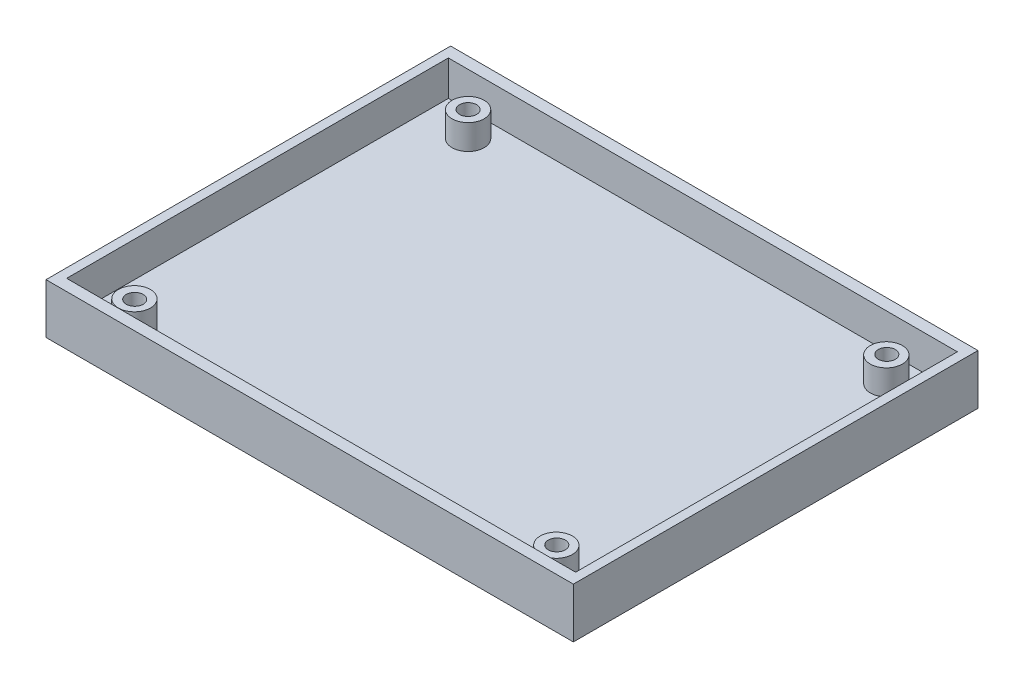
ISO-10303-21;
HEADER;
FILE_DESCRIPTION(('STEP AP214'),'2;1');
FILE_NAME('part.step','',(''),(''),'','','');
FILE_SCHEMA(('AUTOMOTIVE_DESIGN { 1 0 10303 214 1 1 1 1 }'));
ENDSEC;
DATA;
#1=APPLICATION_CONTEXT('core data for automotive mechanical design processes');
#2=APPLICATION_PROTOCOL_DEFINITION('international standard','automotive_design',2000,#1);
#3=PRODUCT_CONTEXT('',#1,'mechanical');
#4=PRODUCT('Part','Part','',(#3));
#5=PRODUCT_RELATED_PRODUCT_CATEGORY('part','',(#4));
#6=PRODUCT_DEFINITION_FORMATION('','',#4);
#7=PRODUCT_DEFINITION_CONTEXT('part definition',#1,'design');
#8=PRODUCT_DEFINITION('design','',#6,#7);
#9=PRODUCT_DEFINITION_SHAPE('','',#8);
#10=(LENGTH_UNIT() NAMED_UNIT(*) SI_UNIT(.MILLI.,.METRE.));
#11=(NAMED_UNIT(*) PLANE_ANGLE_UNIT() SI_UNIT($,.RADIAN.));
#12=(NAMED_UNIT(*) SI_UNIT($,.STERADIAN.) SOLID_ANGLE_UNIT());
#13=UNCERTAINTY_MEASURE_WITH_UNIT(LENGTH_MEASURE(1.E-05),#10,'distance_accuracy_value','');
#14=(GEOMETRIC_REPRESENTATION_CONTEXT(3) GLOBAL_UNCERTAINTY_ASSIGNED_CONTEXT((#13)) GLOBAL_UNIT_ASSIGNED_CONTEXT((#10,
#11,#12)) REPRESENTATION_CONTEXT('',''));
#15=CARTESIAN_POINT('',(0.,0.,0.));
#16=DIRECTION('',(0.,0.,1.));
#17=DIRECTION('',(1.,0.,0.));
#18=AXIS2_PLACEMENT_3D('',#15,#16,#17);
#19=CARTESIAN_POINT('',(0.,3.,0.));
#20=DIRECTION('',(0.,1.,0.));
#21=DIRECTION('',(0.,0.,1.));
#22=AXIS2_PLACEMENT_3D('',#19,#20,#21);
#23=PLANE('',#22);
#24=CARTESIAN_POINT('',(42.2061859404252,3.,33.3587219433355));
#25=DIRECTION('',(0.,1.,0.));
#26=DIRECTION('',(0.,0.,1.));
#27=AXIS2_PLACEMENT_3D('',#24,#25,#26);
#28=CIRCLE('',#27,3.20126111857841);
#29=CARTESIAN_POINT('',(42.2061859404252,3.,36.5599830619139));
#30=VERTEX_POINT('',#29);
#31=EDGE_CURVE('E182',#30,#30,#28,.T.);
#32=ORIENTED_EDGE('',*,*,#31,.F.);
#33=EDGE_LOOP('',(#32));
#34=FACE_BOUND('',#33,.T.);
#35=CARTESIAN_POINT('',(-42.5117529195093,3.,32.859842276581));
#36=DIRECTION('',(0.,1.,0.));
#37=DIRECTION('',(0.,0.,1.));
#38=AXIS2_PLACEMENT_3D('',#35,#36,#37);
#39=CIRCLE('',#38,3.20126111857841);
#40=CARTESIAN_POINT('',(-42.5117529195093,3.,36.0611033951594));
#41=VERTEX_POINT('',#40);
#42=EDGE_CURVE('E194',#41,#41,#39,.T.);
#43=ORIENTED_EDGE('',*,*,#42,.F.);
#44=EDGE_LOOP('',(#43));
#45=FACE_BOUND('',#44,.T.);
#46=CARTESIAN_POINT('',(42.2258959836118,3.,-32.4941746176851));
#47=DIRECTION('',(0.,1.,0.));
#48=DIRECTION('',(0.,0.,1.));
#49=AXIS2_PLACEMENT_3D('',#46,#47,#48);
#50=CIRCLE('',#49,3.20126111857841);
#51=CARTESIAN_POINT('',(42.2258959836118,3.,-29.2929134991067));
#52=VERTEX_POINT('',#51);
#53=EDGE_CURVE('E198',#52,#52,#50,.T.);
#54=ORIENTED_EDGE('',*,*,#53,.F.);
#55=EDGE_LOOP('',(#54));
#56=FACE_BOUND('',#55,.T.);
#57=CARTESIAN_POINT('',(-41.91,3.,-33.147));
#58=DIRECTION('',(0.,1.,0.));
#59=DIRECTION('',(0.,0.,1.));
#60=AXIS2_PLACEMENT_3D('',#57,#58,#59);
#61=CIRCLE('',#60,3.20126111857841);
#62=CARTESIAN_POINT('',(-41.91,3.,-29.9457388814216));
#63=VERTEX_POINT('',#62);
#64=EDGE_CURVE('E202',#63,#63,#61,.T.);
#65=ORIENTED_EDGE('',*,*,#64,.F.);
#66=EDGE_LOOP('',(#65));
#67=FACE_BOUND('',#66,.T.);
#68=DIRECTION('',(1.,0.,0.));
#69=VECTOR('',#68,1.);
#70=CARTESIAN_POINT('',(0.,3.,38.1));
#71=LINE('',#70,#69);
#72=CARTESIAN_POINT('',(-50.8,3.,38.1));
#73=VERTEX_POINT('',#72);
#74=CARTESIAN_POINT('',(50.8,3.,38.1));
#75=VERTEX_POINT('',#74);
#76=EDGE_CURVE('E206',#73,#75,#71,.T.);
#77=ORIENTED_EDGE('',*,*,#76,.T.);
#78=DIRECTION('',(0.,0.,-1.));
#79=VECTOR('',#78,1.);
#80=CARTESIAN_POINT('',(50.8,3.,0.));
#81=LINE('',#80,#79);
#82=CARTESIAN_POINT('',(50.8,3.,-38.1));
#83=VERTEX_POINT('',#82);
#84=EDGE_CURVE('E108',#75,#83,#81,.T.);
#85=ORIENTED_EDGE('',*,*,#84,.T.);
#86=DIRECTION('',(1.,0.,0.));
#87=VECTOR('',#86,1.);
#88=CARTESIAN_POINT('',(0.,3.,-38.1));
#89=LINE('',#88,#87);
#90=CARTESIAN_POINT('',(-50.8,3.,-38.1));
#91=VERTEX_POINT('',#90);
#92=EDGE_CURVE('E50',#91,#83,#89,.T.);
#93=ORIENTED_EDGE('',*,*,#92,.F.);
#94=DIRECTION('',(0.,0.,-1.));
#95=VECTOR('',#94,1.);
#96=CARTESIAN_POINT('',(-50.8,3.,0.));
#97=LINE('',#96,#95);
#98=EDGE_CURVE('E11',#73,#91,#97,.T.);
#99=ORIENTED_EDGE('',*,*,#98,.F.);
#100=EDGE_LOOP('',(#77,#85,#93,#99));
#101=FACE_BOUND('',#100,.T.);
#102=ADVANCED_FACE('F41',(#34,#45,#56,#67,#101),#23,.T.);
#103=CARTESIAN_POINT('',(0.,0.,0.));
#104=DIRECTION('',(0.,1.,0.));
#105=DIRECTION('',(0.,0.,1.));
#106=AXIS2_PLACEMENT_3D('',#103,#104,#105);
#107=PLANE('',#106);
#108=DIRECTION('',(1.,0.,0.));
#109=VECTOR('',#108,1.);
#110=CARTESIAN_POINT('',(0.,0.,40.384480661127));
#111=LINE('',#110,#109);
#112=CARTESIAN_POINT('',(-52.6322329927802,0.,40.384480661127));
#113=VERTEX_POINT('',#112);
#114=CARTESIAN_POINT('',(52.6322329927802,0.,40.384480661127));
#115=VERTEX_POINT('',#114);
#116=EDGE_CURVE('E154',#113,#115,#111,.T.);
#117=ORIENTED_EDGE('',*,*,#116,.F.);
#118=DIRECTION('',(0.,0.,-1.));
#119=VECTOR('',#118,1.);
#120=CARTESIAN_POINT('',(-52.6322329927802,0.,0.));
#121=LINE('',#120,#119);
#122=CARTESIAN_POINT('',(-52.6322329927802,0.,-40.384480661127));
#123=VERTEX_POINT('',#122);
#124=EDGE_CURVE('E124',#113,#123,#121,.T.);
#125=ORIENTED_EDGE('',*,*,#124,.T.);
#126=DIRECTION('',(1.,0.,0.));
#127=VECTOR('',#126,1.);
#128=CARTESIAN_POINT('',(0.,0.,-40.384480661127));
#129=LINE('',#128,#127);
#130=CARTESIAN_POINT('',(52.6322329927802,0.,-40.384480661127));
#131=VERTEX_POINT('',#130);
#132=EDGE_CURVE('E163',#123,#131,#129,.T.);
#133=ORIENTED_EDGE('',*,*,#132,.T.);
#134=DIRECTION('',(0.,0.,-1.));
#135=VECTOR('',#134,1.);
#136=CARTESIAN_POINT('',(52.6322329927802,0.,0.));
#137=LINE('',#136,#135);
#138=EDGE_CURVE('E158',#115,#131,#137,.T.);
#139=ORIENTED_EDGE('',*,*,#138,.F.);
#140=EDGE_LOOP('',(#117,#125,#133,#139));
#141=FACE_BOUND('',#140,.T.);
#142=CARTESIAN_POINT('',(-41.91,0.,-33.147));
#143=DIRECTION('',(0.,1.,0.));
#144=DIRECTION('',(0.,0.,1.));
#145=AXIS2_PLACEMENT_3D('',#142,#143,#144);
#146=CIRCLE('',#145,1.7);
#147=CARTESIAN_POINT('',(-41.91,0.,-31.447));
#148=VERTEX_POINT('',#147);
#149=EDGE_CURVE('E357',#148,#148,#146,.T.);
#150=ORIENTED_EDGE('',*,*,#149,.T.);
#151=EDGE_LOOP('',(#150));
#152=FACE_BOUND('',#151,.T.);
#153=CARTESIAN_POINT('',(42.2050924942106,0.,33.2675434954366));
#154=DIRECTION('',(0.,1.,0.));
#155=DIRECTION('',(0.,0.,1.));
#156=AXIS2_PLACEMENT_3D('',#153,#154,#155);
#157=CIRCLE('',#156,1.7);
#158=CARTESIAN_POINT('',(42.2050924942106,0.,34.9675434954366));
#159=VERTEX_POINT('',#158);
#160=EDGE_CURVE('E347',#159,#159,#157,.T.);
#161=ORIENTED_EDGE('',*,*,#160,.T.);
#162=EDGE_LOOP('',(#161));
#163=FACE_BOUND('',#162,.T.);
#164=CARTESIAN_POINT('',(-42.3706026608546,0.,32.9365231621487));
#165=DIRECTION('',(0.,1.,0.));
#166=DIRECTION('',(0.,0.,1.));
#167=AXIS2_PLACEMENT_3D('',#164,#165,#166);
#168=CIRCLE('',#167,1.7);
#169=CARTESIAN_POINT('',(-42.3706026608546,0.,34.6365231621486));
#170=VERTEX_POINT('',#169);
#171=EDGE_CURVE('E328',#170,#170,#168,.T.);
#172=ORIENTED_EDGE('',*,*,#171,.T.);
#173=EDGE_LOOP('',(#172));
#174=FACE_BOUND('',#173,.T.);
#175=CARTESIAN_POINT('',(42.2050924942106,0.,-32.6055028288607));
#176=DIRECTION('',(0.,1.,0.));
#177=DIRECTION('',(0.,0.,1.));
#178=AXIS2_PLACEMENT_3D('',#175,#176,#177);
#179=CIRCLE('',#178,1.7);
#180=CARTESIAN_POINT('',(42.2050924942106,0.,-30.9055028288607));
#181=VERTEX_POINT('',#180);
#182=EDGE_CURVE('E335',#181,#181,#179,.T.);
#183=ORIENTED_EDGE('',*,*,#182,.T.);
#184=EDGE_LOOP('',(#183));
#185=FACE_BOUND('',#184,.T.);
#186=ADVANCED_FACE('F43',(#141,#152,#163,#174,#185),#107,.F.);
#187=CARTESIAN_POINT('',(0.,10.,40.384480661127));
#188=DIRECTION('',(0.,0.,-1.));
#189=DIRECTION('',(-1.,0.,0.));
#190=AXIS2_PLACEMENT_3D('',#187,#188,#189);
#191=PLANE('',#190);
#192=ORIENTED_EDGE('',*,*,#116,.T.);
#193=DIRECTION('',(0.,-1.,0.));
#194=VECTOR('',#193,1.);
#195=CARTESIAN_POINT('',(52.6322329927802,10.,40.384480661127));
#196=LINE('',#195,#194);
#197=CARTESIAN_POINT('',(52.6322329927802,10.,40.384480661127));
#198=VERTEX_POINT('',#197);
#199=EDGE_CURVE('E178',#198,#115,#196,.T.);
#200=ORIENTED_EDGE('',*,*,#199,.F.);
#201=DIRECTION('',(1.,0.,0.));
#202=VECTOR('',#201,1.);
#203=CARTESIAN_POINT('',(0.,10.,40.384480661127));
#204=LINE('',#203,#202);
#205=CARTESIAN_POINT('',(-52.6322329927802,10.,40.384480661127));
#206=VERTEX_POINT('',#205);
#207=EDGE_CURVE('E138',#206,#198,#204,.T.);
#208=ORIENTED_EDGE('',*,*,#207,.F.);
#209=DIRECTION('',(0.,-1.,0.));
#210=VECTOR('',#209,1.);
#211=CARTESIAN_POINT('',(-52.6322329927802,10.,40.384480661127));
#212=LINE('',#211,#210);
#213=EDGE_CURVE('E112',#206,#113,#212,.T.);
#214=ORIENTED_EDGE('',*,*,#213,.T.);
#215=EDGE_LOOP('',(#192,#200,#208,#214));
#216=FACE_BOUND('',#215,.T.);
#217=ADVANCED_FACE('F230',(#216),#191,.F.);
#218=CARTESIAN_POINT('',(52.6322329927802,10.,0.));
#219=DIRECTION('',(-1.,0.,0.));
#220=DIRECTION('',(0.,0.,1.));
#221=AXIS2_PLACEMENT_3D('',#218,#219,#220);
#222=PLANE('',#221);
#223=ORIENTED_EDGE('',*,*,#138,.T.);
#224=DIRECTION('',(0.,-1.,0.));
#225=VECTOR('',#224,1.);
#226=CARTESIAN_POINT('',(52.6322329927802,10.,-40.384480661127));
#227=LINE('',#226,#225);
#228=CARTESIAN_POINT('',(52.6322329927802,10.,-40.384480661127));
#229=VERTEX_POINT('',#228);
#230=EDGE_CURVE('E175',#229,#131,#227,.T.);
#231=ORIENTED_EDGE('',*,*,#230,.F.);
#232=DIRECTION('',(0.,0.,-1.));
#233=VECTOR('',#232,1.);
#234=CARTESIAN_POINT('',(52.6322329927802,10.,0.));
#235=LINE('',#234,#233);
#236=EDGE_CURVE('E142',#198,#229,#235,.T.);
#237=ORIENTED_EDGE('',*,*,#236,.F.);
#238=ORIENTED_EDGE('',*,*,#199,.T.);
#239=EDGE_LOOP('',(#223,#231,#237,#238));
#240=FACE_BOUND('',#239,.T.);
#241=ADVANCED_FACE('F240',(#240),#222,.F.);
#242=CARTESIAN_POINT('',(0.,10.,-40.384480661127));
#243=DIRECTION('',(0.,0.,-1.));
#244=DIRECTION('',(-1.,0.,0.));
#245=AXIS2_PLACEMENT_3D('',#242,#243,#244);
#246=PLANE('',#245);
#247=ORIENTED_EDGE('',*,*,#132,.F.);
#248=DIRECTION('',(0.,-1.,0.));
#249=VECTOR('',#248,1.);
#250=CARTESIAN_POINT('',(-52.6322329927802,10.,-40.384480661127));
#251=LINE('',#250,#249);
#252=CARTESIAN_POINT('',(-52.6322329927802,10.,-40.384480661127));
#253=VERTEX_POINT('',#252);
#254=EDGE_CURVE('E172',#253,#123,#251,.T.);
#255=ORIENTED_EDGE('',*,*,#254,.F.);
#256=DIRECTION('',(1.,0.,0.));
#257=VECTOR('',#256,1.);
#258=CARTESIAN_POINT('',(0.,10.,-40.384480661127));
#259=LINE('',#258,#257);
#260=EDGE_CURVE('E145',#253,#229,#259,.T.);
#261=ORIENTED_EDGE('',*,*,#260,.T.);
#262=ORIENTED_EDGE('',*,*,#230,.T.);
#263=EDGE_LOOP('',(#247,#255,#261,#262));
#264=FACE_BOUND('',#263,.T.);
#265=ADVANCED_FACE('F236',(#264),#246,.T.);
#266=CARTESIAN_POINT('',(50.8,10.,0.));
#267=DIRECTION('',(-1.,0.,0.));
#268=DIRECTION('',(0.,0.,1.));
#269=AXIS2_PLACEMENT_3D('',#266,#267,#268);
#270=PLANE('',#269);
#271=DIRECTION('',(0.,-1.,0.));
#272=VECTOR('',#271,1.);
#273=CARTESIAN_POINT('',(50.8,10.,-38.1));
#274=LINE('',#273,#272);
#275=CARTESIAN_POINT('',(50.8,10.,-38.1));
#276=VERTEX_POINT('',#275);
#277=EDGE_CURVE('E153',#276,#83,#274,.T.);
#278=ORIENTED_EDGE('',*,*,#277,.T.);
#279=ORIENTED_EDGE('',*,*,#84,.F.);
#280=DIRECTION('',(0.,-1.,0.));
#281=VECTOR('',#280,1.);
#282=CARTESIAN_POINT('',(50.8,10.,38.1));
#283=LINE('',#282,#281);
#284=CARTESIAN_POINT('',(50.8,10.,38.1));
#285=VERTEX_POINT('',#284);
#286=EDGE_CURVE('E103',#285,#75,#283,.T.);
#287=ORIENTED_EDGE('',*,*,#286,.F.);
#288=DIRECTION('',(0.,0.,-1.));
#289=VECTOR('',#288,1.);
#290=CARTESIAN_POINT('',(50.8,10.,0.));
#291=LINE('',#290,#289);
#292=EDGE_CURVE('E107',#285,#276,#291,.T.);
#293=ORIENTED_EDGE('',*,*,#292,.T.);
#294=EDGE_LOOP('',(#278,#279,#287,#293));
#295=FACE_BOUND('',#294,.T.);
#296=ADVANCED_FACE('F106',(#295),#270,.T.);
#297=CARTESIAN_POINT('',(0.,10.,38.1));
#298=DIRECTION('',(0.,0.,-1.));
#299=DIRECTION('',(-1.,0.,0.));
#300=AXIS2_PLACEMENT_3D('',#297,#298,#299);
#301=PLANE('',#300);
#302=ORIENTED_EDGE('',*,*,#286,.T.);
#303=ORIENTED_EDGE('',*,*,#76,.F.);
#304=DIRECTION('',(0.,-1.,0.));
#305=VECTOR('',#304,1.);
#306=CARTESIAN_POINT('',(-50.8,10.,38.1));
#307=LINE('',#306,#305);
#308=CARTESIAN_POINT('',(-50.8,10.,38.1));
#309=VERTEX_POINT('',#308);
#310=EDGE_CURVE('E113',#309,#73,#307,.T.);
#311=ORIENTED_EDGE('',*,*,#310,.F.);
#312=DIRECTION('',(1.,0.,0.));
#313=VECTOR('',#312,1.);
#314=CARTESIAN_POINT('',(0.,10.,38.1));
#315=LINE('',#314,#313);
#316=EDGE_CURVE('E119',#309,#285,#315,.T.);
#317=ORIENTED_EDGE('',*,*,#316,.T.);
#318=EDGE_LOOP('',(#302,#303,#311,#317));
#319=FACE_BOUND('',#318,.T.);
#320=ADVANCED_FACE('F126',(#319),#301,.T.);
#321=CARTESIAN_POINT('',(-50.8,10.,0.));
#322=DIRECTION('',(-1.,0.,0.));
#323=DIRECTION('',(0.,0.,1.));
#324=AXIS2_PLACEMENT_3D('',#321,#322,#323);
#325=PLANE('',#324);
#326=ORIENTED_EDGE('',*,*,#98,.T.);
#327=DIRECTION('',(0.,-1.,0.));
#328=VECTOR('',#327,1.);
#329=CARTESIAN_POINT('',(-50.8,10.,-38.1));
#330=LINE('',#329,#328);
#331=CARTESIAN_POINT('',(-50.8,10.,-38.1));
#332=VERTEX_POINT('',#331);
#333=EDGE_CURVE('E185',#332,#91,#330,.T.);
#334=ORIENTED_EDGE('',*,*,#333,.F.);
#335=DIRECTION('',(0.,0.,-1.));
#336=VECTOR('',#335,1.);
#337=CARTESIAN_POINT('',(-50.8,10.,0.));
#338=LINE('',#337,#336);
#339=EDGE_CURVE('E130',#309,#332,#338,.T.);
#340=ORIENTED_EDGE('',*,*,#339,.F.);
#341=ORIENTED_EDGE('',*,*,#310,.T.);
#342=EDGE_LOOP('',(#326,#334,#340,#341));
#343=FACE_BOUND('',#342,.T.);
#344=ADVANCED_FACE('F215',(#343),#325,.F.);
#345=CARTESIAN_POINT('',(0.,10.,-38.1));
#346=DIRECTION('',(0.,0.,-1.));
#347=DIRECTION('',(-1.,0.,0.));
#348=AXIS2_PLACEMENT_3D('',#345,#346,#347);
#349=PLANE('',#348);
#350=ORIENTED_EDGE('',*,*,#92,.T.);
#351=ORIENTED_EDGE('',*,*,#277,.F.);
#352=DIRECTION('',(1.,0.,0.));
#353=VECTOR('',#352,1.);
#354=CARTESIAN_POINT('',(0.,10.,-38.1));
#355=LINE('',#354,#353);
#356=EDGE_CURVE('E121',#332,#276,#355,.T.);
#357=ORIENTED_EDGE('',*,*,#356,.F.);
#358=ORIENTED_EDGE('',*,*,#333,.T.);
#359=EDGE_LOOP('',(#350,#351,#357,#358));
#360=FACE_BOUND('',#359,.T.);
#361=ADVANCED_FACE('F212',(#360),#349,.F.);
#362=CARTESIAN_POINT('',(-52.6322329927802,10.,0.));
#363=DIRECTION('',(-1.,0.,0.));
#364=DIRECTION('',(0.,0.,1.));
#365=AXIS2_PLACEMENT_3D('',#362,#363,#364);
#366=PLANE('',#365);
#367=ORIENTED_EDGE('',*,*,#124,.F.);
#368=ORIENTED_EDGE('',*,*,#213,.F.);
#369=DIRECTION('',(0.,0.,-1.));
#370=VECTOR('',#369,1.);
#371=CARTESIAN_POINT('',(-52.6322329927802,10.,0.));
#372=LINE('',#371,#370);
#373=EDGE_CURVE('E149',#206,#253,#372,.T.);
#374=ORIENTED_EDGE('',*,*,#373,.T.);
#375=ORIENTED_EDGE('',*,*,#254,.T.);
#376=EDGE_LOOP('',(#367,#368,#374,#375));
#377=FACE_BOUND('',#376,.T.);
#378=ADVANCED_FACE('F222',(#377),#366,.T.);
#379=CARTESIAN_POINT('',(0.,10.,0.));
#380=DIRECTION('',(0.,1.,0.));
#381=DIRECTION('',(0.,0.,1.));
#382=AXIS2_PLACEMENT_3D('',#379,#380,#381);
#383=PLANE('',#382);
#384=ORIENTED_EDGE('',*,*,#292,.F.);
#385=ORIENTED_EDGE('',*,*,#316,.F.);
#386=ORIENTED_EDGE('',*,*,#339,.T.);
#387=ORIENTED_EDGE('',*,*,#356,.T.);
#388=EDGE_LOOP('',(#384,#385,#386,#387));
#389=FACE_BOUND('',#388,.T.);
#390=ORIENTED_EDGE('',*,*,#207,.T.);
#391=ORIENTED_EDGE('',*,*,#236,.T.);
#392=ORIENTED_EDGE('',*,*,#260,.F.);
#393=ORIENTED_EDGE('',*,*,#373,.F.);
#394=EDGE_LOOP('',(#390,#391,#392,#393));
#395=FACE_BOUND('',#394,.T.);
#396=ADVANCED_FACE('F117',(#389,#395),#383,.T.);
#397=CARTESIAN_POINT('',(-41.91,8.,-33.147));
#398=DIRECTION('',(0.,-1.,0.));
#399=DIRECTION('',(0.,0.,-1.));
#400=AXIS2_PLACEMENT_3D('',#397,#398,#399);
#401=CYLINDRICAL_SURFACE('',#400,1.7);
#402=CARTESIAN_POINT('',(-41.91,8.,-33.147));
#403=DIRECTION('',(0.,1.,0.));
#404=DIRECTION('',(0.,0.,1.));
#405=AXIS2_PLACEMENT_3D('',#402,#403,#404);
#406=CIRCLE('',#405,1.7);
#407=CARTESIAN_POINT('',(-41.91,8.,-31.447));
#408=VERTEX_POINT('',#407);
#409=EDGE_CURVE('E361',#408,#408,#406,.T.);
#410=ORIENTED_EDGE('',*,*,#409,.T.);
#411=EDGE_LOOP('',(#410));
#412=FACE_BOUND('',#411,.T.);
#413=ORIENTED_EDGE('',*,*,#149,.F.);
#414=EDGE_LOOP('',(#413));
#415=FACE_BOUND('',#414,.T.);
#416=ADVANCED_FACE('F266',(#412,#415),#401,.F.);
#417=CARTESIAN_POINT('',(-41.91,8.,-33.147));
#418=DIRECTION('',(0.,-1.,0.));
#419=DIRECTION('',(0.,0.,-1.));
#420=AXIS2_PLACEMENT_3D('',#417,#418,#419);
#421=CYLINDRICAL_SURFACE('',#420,3.20126111857841);
#422=ORIENTED_EDGE('',*,*,#64,.T.);
#423=EDGE_LOOP('',(#422));
#424=FACE_BOUND('',#423,.T.);
#425=CARTESIAN_POINT('',(-41.91,8.,-33.147));
#426=DIRECTION('',(0.,1.,0.));
#427=DIRECTION('',(0.,0.,1.));
#428=AXIS2_PLACEMENT_3D('',#425,#426,#427);
#429=CIRCLE('',#428,3.20126111857841);
#430=CARTESIAN_POINT('',(-41.91,8.,-29.9457388814216));
#431=VERTEX_POINT('',#430);
#432=EDGE_CURVE('E159',#431,#431,#429,.T.);
#433=ORIENTED_EDGE('',*,*,#432,.F.);
#434=EDGE_LOOP('',(#433));
#435=FACE_BOUND('',#434,.T.);
#436=ADVANCED_FACE('F271',(#424,#435),#421,.T.);
#437=CARTESIAN_POINT('',(0.,8.,0.));
#438=DIRECTION('',(0.,1.,0.));
#439=DIRECTION('',(0.,0.,1.));
#440=AXIS2_PLACEMENT_3D('',#437,#438,#439);
#441=PLANE('',#440);
#442=ORIENTED_EDGE('',*,*,#409,.F.);
#443=EDGE_LOOP('',(#442));
#444=FACE_BOUND('',#443,.T.);
#445=ORIENTED_EDGE('',*,*,#432,.T.);
#446=EDGE_LOOP('',(#445));
#447=FACE_BOUND('',#446,.T.);
#448=ADVANCED_FACE('F277',(#444,#447),#441,.T.);
#449=CARTESIAN_POINT('',(42.2050924942106,8.,33.2675434954366));
#450=DIRECTION('',(0.,-1.,0.));
#451=DIRECTION('',(0.,0.,-1.));
#452=AXIS2_PLACEMENT_3D('',#449,#450,#451);
#453=CYLINDRICAL_SURFACE('',#452,1.7);
#454=CARTESIAN_POINT('',(42.2050924942106,8.,33.2675434954366));
#455=DIRECTION('',(0.,1.,0.));
#456=DIRECTION('',(0.,0.,1.));
#457=AXIS2_PLACEMENT_3D('',#454,#455,#456);
#458=CIRCLE('',#457,1.7);
#459=CARTESIAN_POINT('',(42.2050924942106,8.,34.9675434954366));
#460=VERTEX_POINT('',#459);
#461=EDGE_CURVE('E349',#460,#460,#458,.T.);
#462=ORIENTED_EDGE('',*,*,#461,.T.);
#463=EDGE_LOOP('',(#462));
#464=FACE_BOUND('',#463,.T.);
#465=ORIENTED_EDGE('',*,*,#160,.F.);
#466=EDGE_LOOP('',(#465));
#467=FACE_BOUND('',#466,.T.);
#468=ADVANCED_FACE('F281',(#464,#467),#453,.F.);
#469=CARTESIAN_POINT('',(42.2061859404252,8.,33.3587219433355));
#470=DIRECTION('',(0.,-1.,0.));
#471=DIRECTION('',(0.,0.,-1.));
#472=AXIS2_PLACEMENT_3D('',#469,#470,#471);
#473=CYLINDRICAL_SURFACE('',#472,3.20126111857841);
#474=ORIENTED_EDGE('',*,*,#31,.T.);
#475=EDGE_LOOP('',(#474));
#476=FACE_BOUND('',#475,.T.);
#477=CARTESIAN_POINT('',(42.2061859404252,8.,33.3587219433355));
#478=DIRECTION('',(0.,1.,0.));
#479=DIRECTION('',(0.,0.,1.));
#480=AXIS2_PLACEMENT_3D('',#477,#478,#479);
#481=CIRCLE('',#480,3.20126111857841);
#482=CARTESIAN_POINT('',(42.2061859404252,8.,36.5599830619139));
#483=VERTEX_POINT('',#482);
#484=EDGE_CURVE('E353',#483,#483,#481,.T.);
#485=ORIENTED_EDGE('',*,*,#484,.F.);
#486=EDGE_LOOP('',(#485));
#487=FACE_BOUND('',#486,.T.);
#488=ADVANCED_FACE('F285',(#476,#487),#473,.T.);
#489=CARTESIAN_POINT('',(0.,8.,0.));
#490=DIRECTION('',(0.,1.,0.));
#491=DIRECTION('',(0.,0.,1.));
#492=AXIS2_PLACEMENT_3D('',#489,#490,#491);
#493=PLANE('',#492);
#494=ORIENTED_EDGE('',*,*,#461,.F.);
#495=EDGE_LOOP('',(#494));
#496=FACE_BOUND('',#495,.T.);
#497=ORIENTED_EDGE('',*,*,#484,.T.);
#498=EDGE_LOOP('',(#497));
#499=FACE_BOUND('',#498,.T.);
#500=ADVANCED_FACE('F289',(#496,#499),#493,.T.);
#501=CARTESIAN_POINT('',(-42.3706026608546,8.,32.9365231621487));
#502=DIRECTION('',(0.,-1.,0.));
#503=DIRECTION('',(0.,0.,-1.));
#504=AXIS2_PLACEMENT_3D('',#501,#502,#503);
#505=CYLINDRICAL_SURFACE('',#504,1.7);
#506=CARTESIAN_POINT('',(-42.3706026608546,8.,32.9365231621487));
#507=DIRECTION('',(0.,1.,0.));
#508=DIRECTION('',(0.,0.,1.));
#509=AXIS2_PLACEMENT_3D('',#506,#507,#508);
#510=CIRCLE('',#509,1.7);
#511=CARTESIAN_POINT('',(-42.3706026608546,8.,34.6365231621486));
#512=VERTEX_POINT('',#511);
#513=EDGE_CURVE('E333',#512,#512,#510,.T.);
#514=ORIENTED_EDGE('',*,*,#513,.T.);
#515=EDGE_LOOP('',(#514));
#516=FACE_BOUND('',#515,.T.);
#517=ORIENTED_EDGE('',*,*,#171,.F.);
#518=EDGE_LOOP('',(#517));
#519=FACE_BOUND('',#518,.T.);
#520=ADVANCED_FACE('F293',(#516,#519),#505,.F.);
#521=CARTESIAN_POINT('',(-42.5117529195093,8.,32.859842276581));
#522=DIRECTION('',(0.,-1.,0.));
#523=DIRECTION('',(0.,0.,-1.));
#524=AXIS2_PLACEMENT_3D('',#521,#522,#523);
#525=CYLINDRICAL_SURFACE('',#524,3.20126111857841);
#526=ORIENTED_EDGE('',*,*,#42,.T.);
#527=EDGE_LOOP('',(#526));
#528=FACE_BOUND('',#527,.T.);
#529=CARTESIAN_POINT('',(-42.5117529195093,8.,32.859842276581));
#530=DIRECTION('',(0.,1.,0.));
#531=DIRECTION('',(0.,0.,1.));
#532=AXIS2_PLACEMENT_3D('',#529,#530,#531);
#533=CIRCLE('',#532,3.20126111857841);
#534=CARTESIAN_POINT('',(-42.5117529195093,8.,36.0611033951594));
#535=VERTEX_POINT('',#534);
#536=EDGE_CURVE('E344',#535,#535,#533,.T.);
#537=ORIENTED_EDGE('',*,*,#536,.F.);
#538=EDGE_LOOP('',(#537));
#539=FACE_BOUND('',#538,.T.);
#540=ADVANCED_FACE('F297',(#528,#539),#525,.T.);
#541=CARTESIAN_POINT('',(0.,8.,0.));
#542=DIRECTION('',(0.,1.,0.));
#543=DIRECTION('',(0.,0.,1.));
#544=AXIS2_PLACEMENT_3D('',#541,#542,#543);
#545=PLANE('',#544);
#546=ORIENTED_EDGE('',*,*,#513,.F.);
#547=EDGE_LOOP('',(#546));
#548=FACE_BOUND('',#547,.T.);
#549=ORIENTED_EDGE('',*,*,#536,.T.);
#550=EDGE_LOOP('',(#549));
#551=FACE_BOUND('',#550,.T.);
#552=ADVANCED_FACE('F301',(#548,#551),#545,.T.);
#553=CARTESIAN_POINT('',(42.2050924942106,8.,-32.6055028288607));
#554=DIRECTION('',(0.,-1.,0.));
#555=DIRECTION('',(0.,0.,-1.));
#556=AXIS2_PLACEMENT_3D('',#553,#554,#555);
#557=CYLINDRICAL_SURFACE('',#556,1.7);
#558=CARTESIAN_POINT('',(42.2050924942106,8.,-32.6055028288607));
#559=DIRECTION('',(0.,1.,0.));
#560=DIRECTION('',(0.,0.,1.));
#561=AXIS2_PLACEMENT_3D('',#558,#559,#560);
#562=CIRCLE('',#561,1.7);
#563=CARTESIAN_POINT('',(42.2050924942106,8.,-30.9055028288607));
#564=VERTEX_POINT('',#563);
#565=EDGE_CURVE('E322',#564,#564,#562,.T.);
#566=ORIENTED_EDGE('',*,*,#565,.T.);
#567=EDGE_LOOP('',(#566));
#568=FACE_BOUND('',#567,.T.);
#569=ORIENTED_EDGE('',*,*,#182,.F.);
#570=EDGE_LOOP('',(#569));
#571=FACE_BOUND('',#570,.T.);
#572=ADVANCED_FACE('F305',(#568,#571),#557,.F.);
#573=CARTESIAN_POINT('',(42.2258959836118,8.,-32.4941746176851));
#574=DIRECTION('',(0.,-1.,0.));
#575=DIRECTION('',(0.,0.,-1.));
#576=AXIS2_PLACEMENT_3D('',#573,#574,#575);
#577=CYLINDRICAL_SURFACE('',#576,3.20126111857841);
#578=ORIENTED_EDGE('',*,*,#53,.T.);
#579=EDGE_LOOP('',(#578));
#580=FACE_BOUND('',#579,.T.);
#581=CARTESIAN_POINT('',(42.2258959836118,8.,-32.4941746176851));
#582=DIRECTION('',(0.,1.,0.));
#583=DIRECTION('',(0.,0.,1.));
#584=AXIS2_PLACEMENT_3D('',#581,#582,#583);
#585=CIRCLE('',#584,3.20126111857841);
#586=CARTESIAN_POINT('',(42.2258959836118,8.,-29.2929134991067));
#587=VERTEX_POINT('',#586);
#588=EDGE_CURVE('E325',#587,#587,#585,.T.);
#589=ORIENTED_EDGE('',*,*,#588,.F.);
#590=EDGE_LOOP('',(#589));
#591=FACE_BOUND('',#590,.T.);
#592=ADVANCED_FACE('F309',(#580,#591),#577,.T.);
#593=CARTESIAN_POINT('',(0.,8.,0.));
#594=DIRECTION('',(0.,1.,0.));
#595=DIRECTION('',(0.,0.,1.));
#596=AXIS2_PLACEMENT_3D('',#593,#594,#595);
#597=PLANE('',#596);
#598=ORIENTED_EDGE('',*,*,#565,.F.);
#599=EDGE_LOOP('',(#598));
#600=FACE_BOUND('',#599,.T.);
#601=ORIENTED_EDGE('',*,*,#588,.T.);
#602=EDGE_LOOP('',(#601));
#603=FACE_BOUND('',#602,.T.);
#604=ADVANCED_FACE('F313',(#600,#603),#597,.T.);
#605=CLOSED_SHELL('',(#102,#186,#217,#241,#265,#296,#320,#344,#361,#378,#396,#416,#436,#448,
#468,#488,#500,#520,#540,#552,#572,#592,#604));
#606=MANIFOLD_SOLID_BREP('B2',#605);
#607=ADVANCED_BREP_SHAPE_REPRESENTATION('',(#18,#606),#14);
#608=SHAPE_DEFINITION_REPRESENTATION(#9,#607);
ENDSEC;
END-ISO-10303-21;
